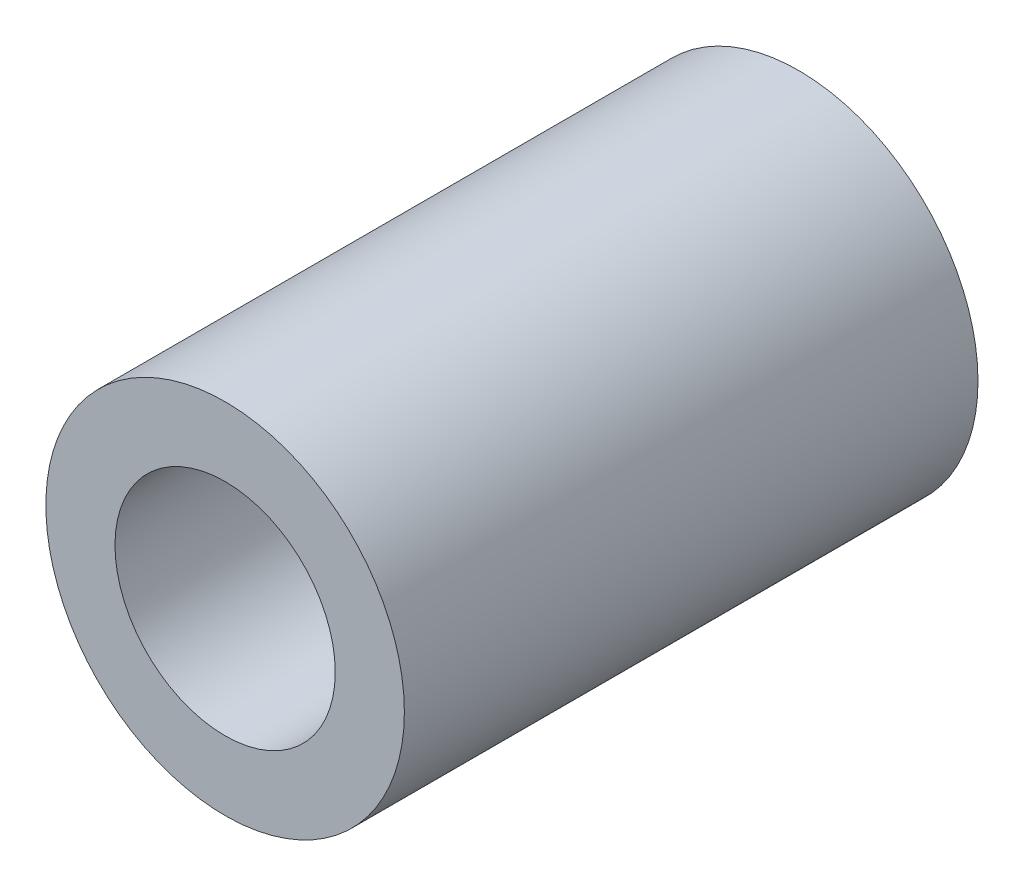
ISO-10303-21;
HEADER;
FILE_DESCRIPTION(('STEP AP214'),'2;1');
FILE_NAME('part.step','',(''),(''),'','','');
FILE_SCHEMA(('AUTOMOTIVE_DESIGN { 1 0 10303 214 1 1 1 1 }'));
ENDSEC;
DATA;
#1=APPLICATION_CONTEXT('core data for automotive mechanical design processes');
#2=APPLICATION_PROTOCOL_DEFINITION('international standard','automotive_design',2000,#1);
#3=PRODUCT_CONTEXT('',#1,'mechanical');
#4=PRODUCT('Part','Part','',(#3));
#5=PRODUCT_RELATED_PRODUCT_CATEGORY('part','',(#4));
#6=PRODUCT_DEFINITION_FORMATION('','',#4);
#7=PRODUCT_DEFINITION_CONTEXT('part definition',#1,'design');
#8=PRODUCT_DEFINITION('design','',#6,#7);
#9=PRODUCT_DEFINITION_SHAPE('','',#8);
#10=(LENGTH_UNIT() NAMED_UNIT(*) SI_UNIT(.MILLI.,.METRE.));
#11=(NAMED_UNIT(*) PLANE_ANGLE_UNIT() SI_UNIT($,.RADIAN.));
#12=(NAMED_UNIT(*) SI_UNIT($,.STERADIAN.) SOLID_ANGLE_UNIT());
#13=UNCERTAINTY_MEASURE_WITH_UNIT(LENGTH_MEASURE(1.E-05),#10,'distance_accuracy_value','');
#14=(GEOMETRIC_REPRESENTATION_CONTEXT(3) GLOBAL_UNCERTAINTY_ASSIGNED_CONTEXT((#13)) GLOBAL_UNIT_ASSIGNED_CONTEXT((#10,
#11,#12)) REPRESENTATION_CONTEXT('',''));
#15=CARTESIAN_POINT('',(0.,0.,0.));
#16=DIRECTION('',(0.,0.,1.));
#17=DIRECTION('',(1.,0.,0.));
#18=AXIS2_PLACEMENT_3D('',#15,#16,#17);
#19=CARTESIAN_POINT('',(0.,0.,6.35));
#20=DIRECTION('',(0.,0.,1.));
#21=DIRECTION('',(1.,0.,0.));
#22=AXIS2_PLACEMENT_3D('',#19,#20,#21);
#23=PLANE('',#22);
#24=CARTESIAN_POINT('',(0.,0.,6.35));
#25=DIRECTION('',(0.,0.,1.));
#26=DIRECTION('',(1.,0.,0.));
#27=AXIS2_PLACEMENT_3D('',#24,#25,#26);
#28=CIRCLE('',#27,3.96875);
#29=CARTESIAN_POINT('',(3.96875,0.,6.35));
#30=VERTEX_POINT('',#29);
#31=EDGE_CURVE('E10',#30,#30,#28,.T.);
#32=ORIENTED_EDGE('',*,*,#31,.T.);
#33=EDGE_LOOP('',(#32));
#34=FACE_BOUND('',#33,.T.);
#35=CARTESIAN_POINT('',(0.,0.,6.35));
#36=DIRECTION('',(0.,0.,1.));
#37=DIRECTION('',(1.,0.,0.));
#38=AXIS2_PLACEMENT_3D('',#35,#36,#37);
#39=CIRCLE('',#38,2.4384);
#40=CARTESIAN_POINT('',(2.4384,0.,6.35));
#41=VERTEX_POINT('',#40);
#42=EDGE_CURVE('E41',#41,#41,#39,.T.);
#43=ORIENTED_EDGE('',*,*,#42,.F.);
#44=EDGE_LOOP('',(#43));
#45=FACE_BOUND('',#44,.T.);
#46=ADVANCED_FACE('F30',(#34,#45),#23,.T.);
#47=CARTESIAN_POINT('',(0.,0.,-6.35));
#48=DIRECTION('',(0.,0.,1.));
#49=DIRECTION('',(1.,0.,0.));
#50=AXIS2_PLACEMENT_3D('',#47,#48,#49);
#51=PLANE('',#50);
#52=CARTESIAN_POINT('',(0.,0.,-6.35));
#53=DIRECTION('',(0.,0.,1.));
#54=DIRECTION('',(1.,0.,0.));
#55=AXIS2_PLACEMENT_3D('',#52,#53,#54);
#56=CIRCLE('',#55,3.96875);
#57=CARTESIAN_POINT('',(3.96875,0.,-6.35));
#58=VERTEX_POINT('',#57);
#59=EDGE_CURVE('E34',#58,#58,#56,.T.);
#60=ORIENTED_EDGE('',*,*,#59,.F.);
#61=EDGE_LOOP('',(#60));
#62=FACE_BOUND('',#61,.T.);
#63=CARTESIAN_POINT('',(0.,0.,-6.35));
#64=DIRECTION('',(0.,0.,1.));
#65=DIRECTION('',(1.,0.,0.));
#66=AXIS2_PLACEMENT_3D('',#63,#64,#65);
#67=CIRCLE('',#66,2.4384);
#68=CARTESIAN_POINT('',(2.4384,0.,-6.35));
#69=VERTEX_POINT('',#68);
#70=EDGE_CURVE('E43',#69,#69,#67,.T.);
#71=ORIENTED_EDGE('',*,*,#70,.T.);
#72=EDGE_LOOP('',(#71));
#73=FACE_BOUND('',#72,.T.);
#74=ADVANCED_FACE('F53',(#62,#73),#51,.F.);
#75=CARTESIAN_POINT('',(0.,0.,6.35));
#76=DIRECTION('',(0.,0.,-1.));
#77=DIRECTION('',(-1.,0.,0.));
#78=AXIS2_PLACEMENT_3D('',#75,#76,#77);
#79=CYLINDRICAL_SURFACE('',#78,3.96875);
#80=ORIENTED_EDGE('',*,*,#31,.F.);
#81=EDGE_LOOP('',(#80));
#82=FACE_BOUND('',#81,.T.);
#83=ORIENTED_EDGE('',*,*,#59,.T.);
#84=EDGE_LOOP('',(#83));
#85=FACE_BOUND('',#84,.T.);
#86=ADVANCED_FACE('F32',(#82,#85),#79,.T.);
#87=CARTESIAN_POINT('',(0.,0.,6.35));
#88=DIRECTION('',(0.,0.,-1.));
#89=DIRECTION('',(-1.,0.,0.));
#90=AXIS2_PLACEMENT_3D('',#87,#88,#89);
#91=CYLINDRICAL_SURFACE('',#90,2.4384);
#92=ORIENTED_EDGE('',*,*,#42,.T.);
#93=EDGE_LOOP('',(#92));
#94=FACE_BOUND('',#93,.T.);
#95=ORIENTED_EDGE('',*,*,#70,.F.);
#96=EDGE_LOOP('',(#95));
#97=FACE_BOUND('',#96,.T.);
#98=ADVANCED_FACE('F49',(#94,#97),#91,.F.);
#99=CLOSED_SHELL('',(#46,#74,#86,#98));
#100=MANIFOLD_SOLID_BREP('B2',#99);
#101=ADVANCED_BREP_SHAPE_REPRESENTATION('',(#18,#100),#14);
#102=SHAPE_DEFINITION_REPRESENTATION(#9,#101);
ENDSEC;
END-ISO-10303-21;
